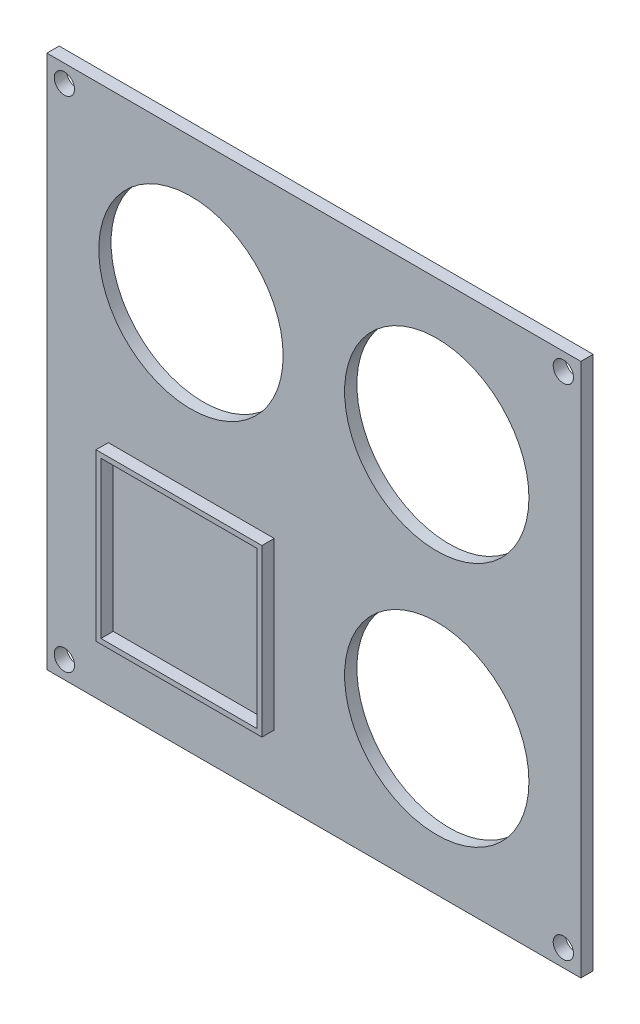
ISO-10303-21;
HEADER;
FILE_DESCRIPTION(('STEP AP214'),'2;1');
FILE_NAME('part.step','',(''),(''),'','','');
FILE_SCHEMA(('AUTOMOTIVE_DESIGN { 1 0 10303 214 1 1 1 1 }'));
ENDSEC;
DATA;
#1=APPLICATION_CONTEXT('core data for automotive mechanical design processes');
#2=APPLICATION_PROTOCOL_DEFINITION('international standard','automotive_design',2000,#1);
#3=PRODUCT_CONTEXT('',#1,'mechanical');
#4=PRODUCT('Part','Part','',(#3));
#5=PRODUCT_RELATED_PRODUCT_CATEGORY('part','',(#4));
#6=PRODUCT_DEFINITION_FORMATION('','',#4);
#7=PRODUCT_DEFINITION_CONTEXT('part definition',#1,'design');
#8=PRODUCT_DEFINITION('design','',#6,#7);
#9=PRODUCT_DEFINITION_SHAPE('','',#8);
#10=(LENGTH_UNIT() NAMED_UNIT(*) SI_UNIT(.MILLI.,.METRE.));
#11=(NAMED_UNIT(*) PLANE_ANGLE_UNIT() SI_UNIT($,.RADIAN.));
#12=(NAMED_UNIT(*) SI_UNIT($,.STERADIAN.) SOLID_ANGLE_UNIT());
#13=UNCERTAINTY_MEASURE_WITH_UNIT(LENGTH_MEASURE(1.E-05),#10,'distance_accuracy_value','');
#14=(GEOMETRIC_REPRESENTATION_CONTEXT(3) GLOBAL_UNCERTAINTY_ASSIGNED_CONTEXT((#13)) GLOBAL_UNIT_ASSIGNED_CONTEXT((#10,
#11,#12)) REPRESENTATION_CONTEXT('',''));
#15=CARTESIAN_POINT('',(0.,0.,0.));
#16=DIRECTION('',(0.,0.,1.));
#17=DIRECTION('',(1.,0.,0.));
#18=AXIS2_PLACEMENT_3D('',#15,#16,#17);
#19=CARTESIAN_POINT('',(0.,0.,2.));
#20=DIRECTION('',(0.,0.,-1.));
#21=DIRECTION('',(-1.,0.,0.));
#22=AXIS2_PLACEMENT_3D('',#19,#20,#21);
#23=PLANE('',#22);
#24=CARTESIAN_POINT('',(-63.45,63.45,2.));
#25=DIRECTION('',(0.,0.,1.));
#26=DIRECTION('',(1.,0.,0.));
#27=AXIS2_PLACEMENT_3D('',#24,#25,#26);
#28=CIRCLE('',#27,15.);
#29=CARTESIAN_POINT('',(-48.45,63.45,2.));
#30=VERTEX_POINT('',#29);
#31=EDGE_CURVE('E480',#30,#30,#28,.T.);
#32=ORIENTED_EDGE('',*,*,#31,.F.);
#33=EDGE_LOOP('',(#32));
#34=FACE_BOUND('',#33,.T.);
#35=CARTESIAN_POINT('',(-23.45,63.45,2.));
#36=DIRECTION('',(0.,0.,1.));
#37=DIRECTION('',(1.,0.,0.));
#38=AXIS2_PLACEMENT_3D('',#35,#36,#37);
#39=CIRCLE('',#38,15.);
#40=CARTESIAN_POINT('',(-8.44999999999999,63.45,2.));
#41=VERTEX_POINT('',#40);
#42=EDGE_CURVE('E476',#41,#41,#39,.T.);
#43=ORIENTED_EDGE('',*,*,#42,.F.);
#44=EDGE_LOOP('',(#43));
#45=FACE_BOUND('',#44,.T.);
#46=CARTESIAN_POINT('',(-23.45,23.45,2.));
#47=DIRECTION('',(0.,0.,1.));
#48=DIRECTION('',(1.,0.,0.));
#49=AXIS2_PLACEMENT_3D('',#46,#47,#48);
#50=CIRCLE('',#49,15.);
#51=CARTESIAN_POINT('',(-8.44999999999999,23.45,2.));
#52=VERTEX_POINT('',#51);
#53=EDGE_CURVE('E486',#52,#52,#50,.T.);
#54=ORIENTED_EDGE('',*,*,#53,.F.);
#55=EDGE_LOOP('',(#54));
#56=FACE_BOUND('',#55,.T.);
#57=DIRECTION('',(-1.,0.,0.));
#58=VECTOR('',#57,1.);
#59=CARTESIAN_POINT('',(0.,0.,2.));
#60=LINE('',#59,#58);
#61=CARTESIAN_POINT('',(0.,0.,2.));
#62=VERTEX_POINT('',#61);
#63=CARTESIAN_POINT('',(-86.9,0.,2.));
#64=VERTEX_POINT('',#63);
#65=EDGE_CURVE('E234',#62,#64,#60,.T.);
#66=ORIENTED_EDGE('',*,*,#65,.F.);
#67=DIRECTION('',(0.,1.,0.));
#68=VECTOR('',#67,1.);
#69=CARTESIAN_POINT('',(0.,0.,2.));
#70=LINE('',#69,#68);
#71=CARTESIAN_POINT('',(0.,86.9,2.));
#72=VERTEX_POINT('',#71);
#73=EDGE_CURVE('E242',#62,#72,#70,.T.);
#74=ORIENTED_EDGE('',*,*,#73,.T.);
#75=DIRECTION('',(-1.,0.,0.));
#76=VECTOR('',#75,1.);
#77=CARTESIAN_POINT('',(0.,86.9,2.));
#78=LINE('',#77,#76);
#79=CARTESIAN_POINT('',(-86.9,86.9,2.));
#80=VERTEX_POINT('',#79);
#81=EDGE_CURVE('E243',#72,#80,#78,.T.);
#82=ORIENTED_EDGE('',*,*,#81,.T.);
#83=DIRECTION('',(0.,1.,0.));
#84=VECTOR('',#83,1.);
#85=CARTESIAN_POINT('',(-86.9,0.,2.));
#86=LINE('',#85,#84);
#87=EDGE_CURVE('E240',#64,#80,#86,.T.);
#88=ORIENTED_EDGE('',*,*,#87,.F.);
#89=EDGE_LOOP('',(#66,#74,#82,#88));
#90=FACE_BOUND('',#89,.T.);
#91=CARTESIAN_POINT('',(-84.05,2.85000000000001,2.));
#92=DIRECTION('',(0.,0.,1.));
#93=DIRECTION('',(1.,0.,0.));
#94=AXIS2_PLACEMENT_3D('',#91,#92,#93);
#95=CIRCLE('',#94,1.65);
#96=CARTESIAN_POINT('',(-82.4,2.85000000000001,2.));
#97=VERTEX_POINT('',#96);
#98=EDGE_CURVE('E213',#97,#97,#95,.T.);
#99=ORIENTED_EDGE('',*,*,#98,.F.);
#100=EDGE_LOOP('',(#99));
#101=FACE_BOUND('',#100,.T.);
#102=CARTESIAN_POINT('',(-2.85,2.84999999999999,2.));
#103=DIRECTION('',(0.,0.,1.));
#104=DIRECTION('',(1.,0.,0.));
#105=AXIS2_PLACEMENT_3D('',#102,#103,#104);
#106=CIRCLE('',#105,1.65);
#107=CARTESIAN_POINT('',(-1.2,2.84999999999999,2.));
#108=VERTEX_POINT('',#107);
#109=EDGE_CURVE('E209',#108,#108,#106,.T.);
#110=ORIENTED_EDGE('',*,*,#109,.F.);
#111=EDGE_LOOP('',(#110));
#112=FACE_BOUND('',#111,.T.);
#113=CARTESIAN_POINT('',(-2.84999999999997,84.05,2.));
#114=DIRECTION('',(0.,0.,1.));
#115=DIRECTION('',(1.,0.,0.));
#116=AXIS2_PLACEMENT_3D('',#113,#114,#115);
#117=CIRCLE('',#116,1.65);
#118=CARTESIAN_POINT('',(-1.19999999999997,84.05,2.));
#119=VERTEX_POINT('',#118);
#120=EDGE_CURVE('E220',#119,#119,#117,.T.);
#121=ORIENTED_EDGE('',*,*,#120,.F.);
#122=EDGE_LOOP('',(#121));
#123=FACE_BOUND('',#122,.T.);
#124=CARTESIAN_POINT('',(-84.05,84.05,2.));
#125=DIRECTION('',(0.,0.,1.));
#126=DIRECTION('',(1.,0.,0.));
#127=AXIS2_PLACEMENT_3D('',#124,#125,#126);
#128=CIRCLE('',#127,1.65);
#129=CARTESIAN_POINT('',(-82.4,84.05,2.));
#130=VERTEX_POINT('',#129);
#131=EDGE_CURVE('E224',#130,#130,#128,.T.);
#132=ORIENTED_EDGE('',*,*,#131,.F.);
#133=EDGE_LOOP('',(#132));
#134=FACE_BOUND('',#133,.T.);
#135=DIRECTION('',(0.,-1.,0.));
#136=VECTOR('',#135,1.);
#137=CARTESIAN_POINT('',(-76.9,10.,2.));
#138=LINE('',#137,#136);
#139=CARTESIAN_POINT('',(-76.9,37.,2.));
#140=VERTEX_POINT('',#139);
#141=CARTESIAN_POINT('',(-76.9,10.,2.));
#142=VERTEX_POINT('',#141);
#143=EDGE_CURVE('E75',#140,#142,#138,.T.);
#144=ORIENTED_EDGE('',*,*,#143,.F.);
#145=DIRECTION('',(-1.,0.,0.));
#146=VECTOR('',#145,1.);
#147=CARTESIAN_POINT('',(-76.9,37.,2.));
#148=LINE('',#147,#146);
#149=CARTESIAN_POINT('',(-49.9,37.,2.));
#150=VERTEX_POINT('',#149);
#151=EDGE_CURVE('E181',#150,#140,#148,.T.);
#152=ORIENTED_EDGE('',*,*,#151,.F.);
#153=DIRECTION('',(0.,1.,0.));
#154=VECTOR('',#153,1.);
#155=CARTESIAN_POINT('',(-49.9,10.,2.));
#156=LINE('',#155,#154);
#157=CARTESIAN_POINT('',(-49.9,10.,2.));
#158=VERTEX_POINT('',#157);
#159=EDGE_CURVE('E194',#158,#150,#156,.T.);
#160=ORIENTED_EDGE('',*,*,#159,.F.);
#161=DIRECTION('',(1.,0.,0.));
#162=VECTOR('',#161,1.);
#163=CARTESIAN_POINT('',(-76.9,10.,2.));
#164=LINE('',#163,#162);
#165=EDGE_CURVE('E192',#142,#158,#164,.T.);
#166=ORIENTED_EDGE('',*,*,#165,.F.);
#167=EDGE_LOOP('',(#144,#152,#160,#166));
#168=FACE_BOUND('',#167,.T.);
#169=ADVANCED_FACE('F50',(#34,#45,#56,#90,#101,#112,#123,#134,#168),#23,.F.);
#170=CARTESIAN_POINT('',(0.,0.,2.));
#171=DIRECTION('',(0.,-1.,0.));
#172=DIRECTION('',(0.,0.,-1.));
#173=AXIS2_PLACEMENT_3D('',#170,#171,#172);
#174=PLANE('',#173);
#175=DIRECTION('',(-1.,0.,0.));
#176=VECTOR('',#175,1.);
#177=CARTESIAN_POINT('',(0.,0.,0.));
#178=LINE('',#177,#176);
#179=CARTESIAN_POINT('',(0.,0.,0.));
#180=VERTEX_POINT('',#179);
#181=CARTESIAN_POINT('',(-86.9,0.,0.));
#182=VERTEX_POINT('',#181);
#183=EDGE_CURVE('E232',#180,#182,#178,.T.);
#184=ORIENTED_EDGE('',*,*,#183,.F.);
#185=DIRECTION('',(0.,0.,-1.));
#186=VECTOR('',#185,1.);
#187=CARTESIAN_POINT('',(0.,0.,2.));
#188=LINE('',#187,#186);
#189=EDGE_CURVE('E11',#62,#180,#188,.T.);
#190=ORIENTED_EDGE('',*,*,#189,.F.);
#191=ORIENTED_EDGE('',*,*,#65,.T.);
#192=DIRECTION('',(0.,0.,-1.));
#193=VECTOR('',#192,1.);
#194=CARTESIAN_POINT('',(-86.9,0.,2.));
#195=LINE('',#194,#193);
#196=EDGE_CURVE('E51',#64,#182,#195,.T.);
#197=ORIENTED_EDGE('',*,*,#196,.T.);
#198=EDGE_LOOP('',(#184,#190,#191,#197));
#199=FACE_BOUND('',#198,.T.);
#200=ADVANCED_FACE('F47',(#199),#174,.T.);
#201=CARTESIAN_POINT('',(0.,0.,2.));
#202=DIRECTION('',(-1.,0.,0.));
#203=DIRECTION('',(0.,0.,1.));
#204=AXIS2_PLACEMENT_3D('',#201,#202,#203);
#205=PLANE('',#204);
#206=DIRECTION('',(0.,1.,0.));
#207=VECTOR('',#206,1.);
#208=CARTESIAN_POINT('',(0.,0.,0.));
#209=LINE('',#208,#207);
#210=CARTESIAN_POINT('',(0.,86.9,0.));
#211=VERTEX_POINT('',#210);
#212=EDGE_CURVE('E236',#180,#211,#209,.T.);
#213=ORIENTED_EDGE('',*,*,#212,.T.);
#214=DIRECTION('',(0.,0.,-1.));
#215=VECTOR('',#214,1.);
#216=CARTESIAN_POINT('',(0.,86.9,2.));
#217=LINE('',#216,#215);
#218=EDGE_CURVE('E57',#72,#211,#217,.T.);
#219=ORIENTED_EDGE('',*,*,#218,.F.);
#220=ORIENTED_EDGE('',*,*,#73,.F.);
#221=ORIENTED_EDGE('',*,*,#189,.T.);
#222=EDGE_LOOP('',(#213,#219,#220,#221));
#223=FACE_BOUND('',#222,.T.);
#224=ADVANCED_FACE('F269',(#223),#205,.F.);
#225=CARTESIAN_POINT('',(0.,86.9,2.));
#226=DIRECTION('',(0.,-1.,0.));
#227=DIRECTION('',(0.,0.,-1.));
#228=AXIS2_PLACEMENT_3D('',#225,#226,#227);
#229=PLANE('',#228);
#230=DIRECTION('',(-1.,0.,0.));
#231=VECTOR('',#230,1.);
#232=CARTESIAN_POINT('',(0.,86.9,0.));
#233=LINE('',#232,#231);
#234=CARTESIAN_POINT('',(-86.9,86.9,0.));
#235=VERTEX_POINT('',#234);
#236=EDGE_CURVE('E246',#211,#235,#233,.T.);
#237=ORIENTED_EDGE('',*,*,#236,.T.);
#238=DIRECTION('',(0.,0.,-1.));
#239=VECTOR('',#238,1.);
#240=CARTESIAN_POINT('',(-86.9,86.9,2.));
#241=LINE('',#240,#239);
#242=EDGE_CURVE('E254',#80,#235,#241,.T.);
#243=ORIENTED_EDGE('',*,*,#242,.F.);
#244=ORIENTED_EDGE('',*,*,#81,.F.);
#245=ORIENTED_EDGE('',*,*,#218,.T.);
#246=EDGE_LOOP('',(#237,#243,#244,#245));
#247=FACE_BOUND('',#246,.T.);
#248=ADVANCED_FACE('F273',(#247),#229,.F.);
#249=CARTESIAN_POINT('',(-86.9,0.,2.));
#250=DIRECTION('',(-1.,0.,0.));
#251=DIRECTION('',(0.,0.,1.));
#252=AXIS2_PLACEMENT_3D('',#249,#250,#251);
#253=PLANE('',#252);
#254=DIRECTION('',(0.,1.,0.));
#255=VECTOR('',#254,1.);
#256=CARTESIAN_POINT('',(-86.9,0.,0.));
#257=LINE('',#256,#255);
#258=EDGE_CURVE('E250',#182,#235,#257,.T.);
#259=ORIENTED_EDGE('',*,*,#258,.F.);
#260=ORIENTED_EDGE('',*,*,#196,.F.);
#261=ORIENTED_EDGE('',*,*,#87,.T.);
#262=ORIENTED_EDGE('',*,*,#242,.T.);
#263=EDGE_LOOP('',(#259,#260,#261,#262));
#264=FACE_BOUND('',#263,.T.);
#265=ADVANCED_FACE('F263',(#264),#253,.T.);
#266=CARTESIAN_POINT('',(0.,0.,0.));
#267=DIRECTION('',(0.,0.,-1.));
#268=DIRECTION('',(-1.,0.,0.));
#269=AXIS2_PLACEMENT_3D('',#266,#267,#268);
#270=PLANE('',#269);
#271=CARTESIAN_POINT('',(-63.45,63.45,0.));
#272=DIRECTION('',(0.,0.,1.));
#273=DIRECTION('',(1.,0.,0.));
#274=AXIS2_PLACEMENT_3D('',#271,#272,#273);
#275=CIRCLE('',#274,15.);
#276=CARTESIAN_POINT('',(-48.45,63.45,0.));
#277=VERTEX_POINT('',#276);
#278=EDGE_CURVE('E168',#277,#277,#275,.T.);
#279=ORIENTED_EDGE('',*,*,#278,.T.);
#280=EDGE_LOOP('',(#279));
#281=FACE_BOUND('',#280,.T.);
#282=CARTESIAN_POINT('',(-23.45,63.45,0.));
#283=DIRECTION('',(0.,0.,1.));
#284=DIRECTION('',(1.,0.,0.));
#285=AXIS2_PLACEMENT_3D('',#282,#283,#284);
#286=CIRCLE('',#285,15.);
#287=CARTESIAN_POINT('',(-8.44999999999999,63.45,0.));
#288=VERTEX_POINT('',#287);
#289=EDGE_CURVE('E485',#288,#288,#286,.T.);
#290=ORIENTED_EDGE('',*,*,#289,.T.);
#291=EDGE_LOOP('',(#290));
#292=FACE_BOUND('',#291,.T.);
#293=CARTESIAN_POINT('',(-23.45,23.45,0.));
#294=DIRECTION('',(0.,0.,1.));
#295=DIRECTION('',(1.,0.,0.));
#296=AXIS2_PLACEMENT_3D('',#293,#294,#295);
#297=CIRCLE('',#296,15.);
#298=CARTESIAN_POINT('',(-8.44999999999999,23.45,0.));
#299=VERTEX_POINT('',#298);
#300=EDGE_CURVE('E162',#299,#299,#297,.T.);
#301=ORIENTED_EDGE('',*,*,#300,.T.);
#302=EDGE_LOOP('',(#301));
#303=FACE_BOUND('',#302,.T.);
#304=CARTESIAN_POINT('',(-84.05,84.05,0.));
#305=DIRECTION('',(0.,0.,1.));
#306=DIRECTION('',(1.,0.,0.));
#307=AXIS2_PLACEMENT_3D('',#304,#305,#306);
#308=CIRCLE('',#307,1.65);
#309=CARTESIAN_POINT('',(-82.4,84.05,0.));
#310=VERTEX_POINT('',#309);
#311=EDGE_CURVE('E207',#310,#310,#308,.T.);
#312=ORIENTED_EDGE('',*,*,#311,.T.);
#313=EDGE_LOOP('',(#312));
#314=FACE_BOUND('',#313,.T.);
#315=CARTESIAN_POINT('',(-2.84999999999997,84.05,0.));
#316=DIRECTION('',(0.,0.,1.));
#317=DIRECTION('',(1.,0.,0.));
#318=AXIS2_PLACEMENT_3D('',#315,#316,#317);
#319=CIRCLE('',#318,1.65);
#320=CARTESIAN_POINT('',(-1.19999999999997,84.05,0.));
#321=VERTEX_POINT('',#320);
#322=EDGE_CURVE('E219',#321,#321,#319,.T.);
#323=ORIENTED_EDGE('',*,*,#322,.T.);
#324=EDGE_LOOP('',(#323));
#325=FACE_BOUND('',#324,.T.);
#326=CARTESIAN_POINT('',(-2.85,2.84999999999999,0.));
#327=DIRECTION('',(0.,0.,1.));
#328=DIRECTION('',(1.,0.,0.));
#329=AXIS2_PLACEMENT_3D('',#326,#327,#328);
#330=CIRCLE('',#329,1.65);
#331=CARTESIAN_POINT('',(-1.2,2.84999999999999,0.));
#332=VERTEX_POINT('',#331);
#333=EDGE_CURVE('E212',#332,#332,#330,.T.);
#334=ORIENTED_EDGE('',*,*,#333,.T.);
#335=EDGE_LOOP('',(#334));
#336=FACE_BOUND('',#335,.T.);
#337=CARTESIAN_POINT('',(-84.05,2.85000000000001,0.));
#338=DIRECTION('',(0.,0.,1.));
#339=DIRECTION('',(1.,0.,0.));
#340=AXIS2_PLACEMENT_3D('',#337,#338,#339);
#341=CIRCLE('',#340,1.65);
#342=CARTESIAN_POINT('',(-82.4,2.85000000000001,0.));
#343=VERTEX_POINT('',#342);
#344=EDGE_CURVE('E227',#343,#343,#341,.T.);
#345=ORIENTED_EDGE('',*,*,#344,.T.);
#346=EDGE_LOOP('',(#345));
#347=FACE_BOUND('',#346,.T.);
#348=ORIENTED_EDGE('',*,*,#183,.T.);
#349=ORIENTED_EDGE('',*,*,#258,.T.);
#350=ORIENTED_EDGE('',*,*,#236,.F.);
#351=ORIENTED_EDGE('',*,*,#212,.F.);
#352=EDGE_LOOP('',(#348,#349,#350,#351));
#353=FACE_BOUND('',#352,.T.);
#354=ADVANCED_FACE('F270',(#281,#292,#303,#314,#325,#336,#347,#353),#270,.T.);
#355=CARTESIAN_POINT('',(-84.05,2.85000000000001,0.));
#356=DIRECTION('',(0.,0.,1.));
#357=DIRECTION('',(1.,0.,0.));
#358=AXIS2_PLACEMENT_3D('',#355,#356,#357);
#359=CYLINDRICAL_SURFACE('',#358,1.65);
#360=ORIENTED_EDGE('',*,*,#344,.F.);
#361=EDGE_LOOP('',(#360));
#362=FACE_BOUND('',#361,.T.);
#363=ORIENTED_EDGE('',*,*,#98,.T.);
#364=EDGE_LOOP('',(#363));
#365=FACE_BOUND('',#364,.T.);
#366=ADVANCED_FACE('F307',(#362,#365),#359,.F.);
#367=CARTESIAN_POINT('',(-2.85,2.84999999999999,0.));
#368=DIRECTION('',(0.,0.,1.));
#369=DIRECTION('',(1.,0.,0.));
#370=AXIS2_PLACEMENT_3D('',#367,#368,#369);
#371=CYLINDRICAL_SURFACE('',#370,1.65);
#372=ORIENTED_EDGE('',*,*,#333,.F.);
#373=EDGE_LOOP('',(#372));
#374=FACE_BOUND('',#373,.T.);
#375=ORIENTED_EDGE('',*,*,#109,.T.);
#376=EDGE_LOOP('',(#375));
#377=FACE_BOUND('',#376,.T.);
#378=ADVANCED_FACE('F302',(#374,#377),#371,.F.);
#379=CARTESIAN_POINT('',(-2.84999999999997,84.05,0.));
#380=DIRECTION('',(0.,0.,1.));
#381=DIRECTION('',(1.,0.,0.));
#382=AXIS2_PLACEMENT_3D('',#379,#380,#381);
#383=CYLINDRICAL_SURFACE('',#382,1.65);
#384=ORIENTED_EDGE('',*,*,#322,.F.);
#385=EDGE_LOOP('',(#384));
#386=FACE_BOUND('',#385,.T.);
#387=ORIENTED_EDGE('',*,*,#120,.T.);
#388=EDGE_LOOP('',(#387));
#389=FACE_BOUND('',#388,.T.);
#390=ADVANCED_FACE('F292',(#386,#389),#383,.F.);
#391=CARTESIAN_POINT('',(-84.05,84.05,0.));
#392=DIRECTION('',(0.,0.,1.));
#393=DIRECTION('',(1.,0.,0.));
#394=AXIS2_PLACEMENT_3D('',#391,#392,#393);
#395=CYLINDRICAL_SURFACE('',#394,1.65);
#396=ORIENTED_EDGE('',*,*,#311,.F.);
#397=EDGE_LOOP('',(#396));
#398=FACE_BOUND('',#397,.T.);
#399=ORIENTED_EDGE('',*,*,#131,.T.);
#400=EDGE_LOOP('',(#399));
#401=FACE_BOUND('',#400,.T.);
#402=ADVANCED_FACE('F288',(#398,#401),#395,.F.);
#403=CARTESIAN_POINT('',(-76.9,10.,4.));
#404=DIRECTION('',(1.,0.,0.));
#405=DIRECTION('',(0.,0.,-1.));
#406=AXIS2_PLACEMENT_3D('',#403,#404,#405);
#407=PLANE('',#406);
#408=ORIENTED_EDGE('',*,*,#143,.T.);
#409=DIRECTION('',(0.,0.,-1.));
#410=VECTOR('',#409,1.);
#411=CARTESIAN_POINT('',(-76.9,10.,4.));
#412=LINE('',#411,#410);
#413=CARTESIAN_POINT('',(-76.9,10.,4.));
#414=VERTEX_POINT('',#413);
#415=EDGE_CURVE('E206',#414,#142,#412,.T.);
#416=ORIENTED_EDGE('',*,*,#415,.F.);
#417=DIRECTION('',(0.,-1.,0.));
#418=VECTOR('',#417,1.);
#419=CARTESIAN_POINT('',(-76.9,10.,4.));
#420=LINE('',#419,#418);
#421=CARTESIAN_POINT('',(-76.9,37.,4.));
#422=VERTEX_POINT('',#421);
#423=EDGE_CURVE('E179',#422,#414,#420,.T.);
#424=ORIENTED_EDGE('',*,*,#423,.F.);
#425=DIRECTION('',(0.,0.,-1.));
#426=VECTOR('',#425,1.);
#427=CARTESIAN_POINT('',(-76.9,37.,4.));
#428=LINE('',#427,#426);
#429=EDGE_CURVE('E190',#422,#140,#428,.T.);
#430=ORIENTED_EDGE('',*,*,#429,.T.);
#431=EDGE_LOOP('',(#408,#416,#424,#430));
#432=FACE_BOUND('',#431,.T.);
#433=ADVANCED_FACE('F286',(#432),#407,.F.);
#434=CARTESIAN_POINT('',(-76.9,10.,4.));
#435=DIRECTION('',(0.,1.,0.));
#436=DIRECTION('',(0.,0.,1.));
#437=AXIS2_PLACEMENT_3D('',#434,#435,#436);
#438=PLANE('',#437);
#439=ORIENTED_EDGE('',*,*,#165,.T.);
#440=DIRECTION('',(0.,0.,-1.));
#441=VECTOR('',#440,1.);
#442=CARTESIAN_POINT('',(-49.9,10.,4.));
#443=LINE('',#442,#441);
#444=CARTESIAN_POINT('',(-49.9,10.,4.));
#445=VERTEX_POINT('',#444);
#446=EDGE_CURVE('E201',#445,#158,#443,.T.);
#447=ORIENTED_EDGE('',*,*,#446,.F.);
#448=DIRECTION('',(1.,0.,0.));
#449=VECTOR('',#448,1.);
#450=CARTESIAN_POINT('',(-76.9,10.,4.));
#451=LINE('',#450,#449);
#452=EDGE_CURVE('E185',#414,#445,#451,.T.);
#453=ORIENTED_EDGE('',*,*,#452,.F.);
#454=ORIENTED_EDGE('',*,*,#415,.T.);
#455=EDGE_LOOP('',(#439,#447,#453,#454));
#456=FACE_BOUND('',#455,.T.);
#457=ADVANCED_FACE('F297',(#456),#438,.F.);
#458=CARTESIAN_POINT('',(-49.9,10.,4.));
#459=DIRECTION('',(-1.,0.,0.));
#460=DIRECTION('',(0.,0.,1.));
#461=AXIS2_PLACEMENT_3D('',#458,#459,#460);
#462=PLANE('',#461);
#463=ORIENTED_EDGE('',*,*,#159,.T.);
#464=DIRECTION('',(0.,0.,-1.));
#465=VECTOR('',#464,1.);
#466=CARTESIAN_POINT('',(-49.9,37.,4.));
#467=LINE('',#466,#465);
#468=CARTESIAN_POINT('',(-49.9,37.,4.));
#469=VERTEX_POINT('',#468);
#470=EDGE_CURVE('E199',#469,#150,#467,.T.);
#471=ORIENTED_EDGE('',*,*,#470,.F.);
#472=DIRECTION('',(0.,1.,0.));
#473=VECTOR('',#472,1.);
#474=CARTESIAN_POINT('',(-49.9,10.,4.));
#475=LINE('',#474,#473);
#476=EDGE_CURVE('E183',#445,#469,#475,.T.);
#477=ORIENTED_EDGE('',*,*,#476,.F.);
#478=ORIENTED_EDGE('',*,*,#446,.T.);
#479=EDGE_LOOP('',(#463,#471,#477,#478));
#480=FACE_BOUND('',#479,.T.);
#481=ADVANCED_FACE('F364',(#480),#462,.F.);
#482=CARTESIAN_POINT('',(-76.9,37.,4.));
#483=DIRECTION('',(0.,-1.,0.));
#484=DIRECTION('',(0.,0.,-1.));
#485=AXIS2_PLACEMENT_3D('',#482,#483,#484);
#486=PLANE('',#485);
#487=ORIENTED_EDGE('',*,*,#151,.T.);
#488=ORIENTED_EDGE('',*,*,#429,.F.);
#489=DIRECTION('',(-1.,0.,0.));
#490=VECTOR('',#489,1.);
#491=CARTESIAN_POINT('',(-76.9,37.,4.));
#492=LINE('',#491,#490);
#493=EDGE_CURVE('E189',#469,#422,#492,.T.);
#494=ORIENTED_EDGE('',*,*,#493,.F.);
#495=ORIENTED_EDGE('',*,*,#470,.T.);
#496=EDGE_LOOP('',(#487,#488,#494,#495));
#497=FACE_BOUND('',#496,.T.);
#498=ADVANCED_FACE('F374',(#497),#486,.F.);
#499=CARTESIAN_POINT('',(0.,0.,4.));
#500=DIRECTION('',(0.,0.,-1.));
#501=DIRECTION('',(-1.,0.,0.));
#502=AXIS2_PLACEMENT_3D('',#499,#500,#501);
#503=PLANE('',#502);
#504=DIRECTION('',(1.,0.,0.));
#505=VECTOR('',#504,1.);
#506=CARTESIAN_POINT('',(-76.1,10.8,4.));
#507=LINE('',#506,#505);
#508=CARTESIAN_POINT('',(-76.1,10.8,4.));
#509=VERTEX_POINT('',#508);
#510=CARTESIAN_POINT('',(-50.7,10.8,4.));
#511=VERTEX_POINT('',#510);
#512=EDGE_CURVE('E166',#509,#511,#507,.T.);
#513=ORIENTED_EDGE('',*,*,#512,.F.);
#514=DIRECTION('',(0.,-1.,0.));
#515=VECTOR('',#514,1.);
#516=CARTESIAN_POINT('',(-76.1,36.2,4.));
#517=LINE('',#516,#515);
#518=CARTESIAN_POINT('',(-76.1,36.2,4.));
#519=VERTEX_POINT('',#518);
#520=EDGE_CURVE('E65',#519,#509,#517,.T.);
#521=ORIENTED_EDGE('',*,*,#520,.F.);
#522=DIRECTION('',(-1.,0.,0.));
#523=VECTOR('',#522,1.);
#524=CARTESIAN_POINT('',(-76.1,36.2,4.));
#525=LINE('',#524,#523);
#526=CARTESIAN_POINT('',(-50.7,36.2,4.));
#527=VERTEX_POINT('',#526);
#528=EDGE_CURVE('E160',#527,#519,#525,.T.);
#529=ORIENTED_EDGE('',*,*,#528,.F.);
#530=DIRECTION('',(0.,1.,0.));
#531=VECTOR('',#530,1.);
#532=CARTESIAN_POINT('',(-50.7,36.2,4.));
#533=LINE('',#532,#531);
#534=EDGE_CURVE('E159',#511,#527,#533,.T.);
#535=ORIENTED_EDGE('',*,*,#534,.F.);
#536=EDGE_LOOP('',(#513,#521,#529,#535));
#537=FACE_BOUND('',#536,.T.);
#538=ORIENTED_EDGE('',*,*,#423,.T.);
#539=ORIENTED_EDGE('',*,*,#452,.T.);
#540=ORIENTED_EDGE('',*,*,#476,.T.);
#541=ORIENTED_EDGE('',*,*,#493,.T.);
#542=EDGE_LOOP('',(#538,#539,#540,#541));
#543=FACE_BOUND('',#542,.T.);
#544=ADVANCED_FACE('F384',(#537,#543),#503,.F.);
#545=CARTESIAN_POINT('',(-76.1,36.2,2.));
#546=DIRECTION('',(-1.,0.,0.));
#547=DIRECTION('',(0.,0.,1.));
#548=AXIS2_PLACEMENT_3D('',#545,#546,#547);
#549=PLANE('',#548);
#550=ORIENTED_EDGE('',*,*,#520,.T.);
#551=DIRECTION('',(0.,0.,1.));
#552=VECTOR('',#551,1.);
#553=CARTESIAN_POINT('',(-76.1,10.8,2.));
#554=LINE('',#553,#552);
#555=CARTESIAN_POINT('',(-76.1,10.8,2.));
#556=VERTEX_POINT('',#555);
#557=EDGE_CURVE('E131',#556,#509,#554,.T.);
#558=ORIENTED_EDGE('',*,*,#557,.F.);
#559=DIRECTION('',(0.,-1.,0.));
#560=VECTOR('',#559,1.);
#561=CARTESIAN_POINT('',(-76.1,36.2,2.));
#562=LINE('',#561,#560);
#563=CARTESIAN_POINT('',(-76.1,36.2,2.));
#564=VERTEX_POINT('',#563);
#565=EDGE_CURVE('E139',#564,#556,#562,.T.);
#566=ORIENTED_EDGE('',*,*,#565,.F.);
#567=DIRECTION('',(0.,0.,1.));
#568=VECTOR('',#567,1.);
#569=CARTESIAN_POINT('',(-76.1,36.2,2.));
#570=LINE('',#569,#568);
#571=EDGE_CURVE('E175',#564,#519,#570,.T.);
#572=ORIENTED_EDGE('',*,*,#571,.T.);
#573=EDGE_LOOP('',(#550,#558,#566,#572));
#574=FACE_BOUND('',#573,.T.);
#575=ADVANCED_FACE('F140',(#574),#549,.F.);
#576=CARTESIAN_POINT('',(-76.1,36.2,2.));
#577=DIRECTION('',(0.,1.,0.));
#578=DIRECTION('',(0.,0.,1.));
#579=AXIS2_PLACEMENT_3D('',#576,#577,#578);
#580=PLANE('',#579);
#581=ORIENTED_EDGE('',*,*,#528,.T.);
#582=ORIENTED_EDGE('',*,*,#571,.F.);
#583=DIRECTION('',(-1.,0.,0.));
#584=VECTOR('',#583,1.);
#585=CARTESIAN_POINT('',(-76.1,36.2,2.));
#586=LINE('',#585,#584);
#587=CARTESIAN_POINT('',(-50.7,36.2,2.));
#588=VERTEX_POINT('',#587);
#589=EDGE_CURVE('E144',#588,#564,#586,.T.);
#590=ORIENTED_EDGE('',*,*,#589,.F.);
#591=DIRECTION('',(0.,0.,1.));
#592=VECTOR('',#591,1.);
#593=CARTESIAN_POINT('',(-50.7,36.2,2.));
#594=LINE('',#593,#592);
#595=EDGE_CURVE('E177',#588,#527,#594,.T.);
#596=ORIENTED_EDGE('',*,*,#595,.T.);
#597=EDGE_LOOP('',(#581,#582,#590,#596));
#598=FACE_BOUND('',#597,.T.);
#599=ADVANCED_FACE('F404',(#598),#580,.F.);
#600=CARTESIAN_POINT('',(-50.7,36.2,2.));
#601=DIRECTION('',(1.,0.,0.));
#602=DIRECTION('',(0.,1.,0.));
#603=AXIS2_PLACEMENT_3D('',#600,#601,#602);
#604=PLANE('',#603);
#605=ORIENTED_EDGE('',*,*,#534,.T.);
#606=ORIENTED_EDGE('',*,*,#595,.F.);
#607=DIRECTION('',(0.,1.,0.));
#608=VECTOR('',#607,1.);
#609=CARTESIAN_POINT('',(-50.7,36.2,2.));
#610=LINE('',#609,#608);
#611=CARTESIAN_POINT('',(-50.7,10.8,2.));
#612=VERTEX_POINT('',#611);
#613=EDGE_CURVE('E153',#612,#588,#610,.T.);
#614=ORIENTED_EDGE('',*,*,#613,.F.);
#615=DIRECTION('',(0.,0.,1.));
#616=VECTOR('',#615,1.);
#617=CARTESIAN_POINT('',(-50.7,10.8,2.));
#618=LINE('',#617,#616);
#619=EDGE_CURVE('E145',#612,#511,#618,.T.);
#620=ORIENTED_EDGE('',*,*,#619,.T.);
#621=EDGE_LOOP('',(#605,#606,#614,#620));
#622=FACE_BOUND('',#621,.T.);
#623=ADVANCED_FACE('F413',(#622),#604,.F.);
#624=CARTESIAN_POINT('',(-76.1,10.8,2.));
#625=DIRECTION('',(0.,-1.,0.));
#626=DIRECTION('',(0.,0.,-1.));
#627=AXIS2_PLACEMENT_3D('',#624,#625,#626);
#628=PLANE('',#627);
#629=ORIENTED_EDGE('',*,*,#512,.T.);
#630=ORIENTED_EDGE('',*,*,#619,.F.);
#631=DIRECTION('',(1.,0.,0.));
#632=VECTOR('',#631,1.);
#633=CARTESIAN_POINT('',(-76.1,10.8,2.));
#634=LINE('',#633,#632);
#635=EDGE_CURVE('E146',#556,#612,#634,.T.);
#636=ORIENTED_EDGE('',*,*,#635,.F.);
#637=ORIENTED_EDGE('',*,*,#557,.T.);
#638=EDGE_LOOP('',(#629,#630,#636,#637));
#639=FACE_BOUND('',#638,.T.);
#640=ADVANCED_FACE('F149',(#639),#628,.F.);
#641=CARTESIAN_POINT('',(0.,0.,2.));
#642=DIRECTION('',(0.,0.,1.));
#643=DIRECTION('',(1.,0.,0.));
#644=AXIS2_PLACEMENT_3D('',#641,#642,#643);
#645=PLANE('',#644);
#646=ORIENTED_EDGE('',*,*,#565,.T.);
#647=ORIENTED_EDGE('',*,*,#635,.T.);
#648=ORIENTED_EDGE('',*,*,#613,.T.);
#649=ORIENTED_EDGE('',*,*,#589,.T.);
#650=EDGE_LOOP('',(#646,#647,#648,#649));
#651=FACE_BOUND('',#650,.T.);
#652=ADVANCED_FACE('F154',(#651),#645,.T.);
#653=CARTESIAN_POINT('',(-23.45,23.45,0.));
#654=DIRECTION('',(0.,0.,1.));
#655=DIRECTION('',(1.,0.,0.));
#656=AXIS2_PLACEMENT_3D('',#653,#654,#655);
#657=CYLINDRICAL_SURFACE('',#656,15.);
#658=ORIENTED_EDGE('',*,*,#300,.F.);
#659=EDGE_LOOP('',(#658));
#660=FACE_BOUND('',#659,.T.);
#661=ORIENTED_EDGE('',*,*,#53,.T.);
#662=EDGE_LOOP('',(#661));
#663=FACE_BOUND('',#662,.T.);
#664=ADVANCED_FACE('F439',(#660,#663),#657,.F.);
#665=CARTESIAN_POINT('',(-23.45,63.45,0.));
#666=DIRECTION('',(0.,0.,1.));
#667=DIRECTION('',(1.,0.,0.));
#668=AXIS2_PLACEMENT_3D('',#665,#666,#667);
#669=CYLINDRICAL_SURFACE('',#668,15.);
#670=ORIENTED_EDGE('',*,*,#289,.F.);
#671=EDGE_LOOP('',(#670));
#672=FACE_BOUND('',#671,.T.);
#673=ORIENTED_EDGE('',*,*,#42,.T.);
#674=EDGE_LOOP('',(#673));
#675=FACE_BOUND('',#674,.T.);
#676=ADVANCED_FACE('F450',(#672,#675),#669,.F.);
#677=CARTESIAN_POINT('',(-63.45,63.45,0.));
#678=DIRECTION('',(0.,0.,1.));
#679=DIRECTION('',(1.,0.,0.));
#680=AXIS2_PLACEMENT_3D('',#677,#678,#679);
#681=CYLINDRICAL_SURFACE('',#680,15.);
#682=ORIENTED_EDGE('',*,*,#278,.F.);
#683=EDGE_LOOP('',(#682));
#684=FACE_BOUND('',#683,.T.);
#685=ORIENTED_EDGE('',*,*,#31,.T.);
#686=EDGE_LOOP('',(#685));
#687=FACE_BOUND('',#686,.T.);
#688=ADVANCED_FACE('F459',(#684,#687),#681,.F.);
#689=CLOSED_SHELL('',(#169,#200,#224,#248,#265,#354,#366,#378,#390,#402,#433,#457,#481,#498,
#544,#575,#599,#623,#640,#652,#664,#676,#688));
#690=MANIFOLD_SOLID_BREP('B2',#689);
#691=ADVANCED_BREP_SHAPE_REPRESENTATION('',(#18,#690),#14);
#692=SHAPE_DEFINITION_REPRESENTATION(#9,#691);
ENDSEC;
END-ISO-10303-21;
